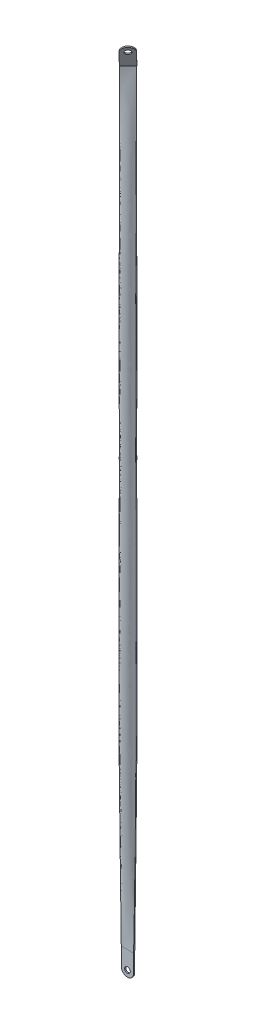
ISO-10303-21;
HEADER;
FILE_DESCRIPTION(('STEP AP214'),'2;1');
FILE_NAME('part.step','',(''),(''),'','','');
FILE_SCHEMA(('AUTOMOTIVE_DESIGN { 1 0 10303 214 1 1 1 1 }'));
ENDSEC;
DATA;
#1=APPLICATION_CONTEXT('core data for automotive mechanical design processes');
#2=APPLICATION_PROTOCOL_DEFINITION('international standard','automotive_design',2000,#1);
#3=PRODUCT_CONTEXT('',#1,'mechanical');
#4=PRODUCT('Part','Part','',(#3));
#5=PRODUCT_RELATED_PRODUCT_CATEGORY('part','',(#4));
#6=PRODUCT_DEFINITION_FORMATION('','',#4);
#7=PRODUCT_DEFINITION_CONTEXT('part definition',#1,'design');
#8=PRODUCT_DEFINITION('design','',#6,#7);
#9=PRODUCT_DEFINITION_SHAPE('','',#8);
#10=(LENGTH_UNIT() NAMED_UNIT(*) SI_UNIT(.MILLI.,.METRE.));
#11=(NAMED_UNIT(*) PLANE_ANGLE_UNIT() SI_UNIT($,.RADIAN.));
#12=(NAMED_UNIT(*) SI_UNIT($,.STERADIAN.) SOLID_ANGLE_UNIT());
#13=UNCERTAINTY_MEASURE_WITH_UNIT(LENGTH_MEASURE(1.E-05),#10,'distance_accuracy_value','');
#14=(GEOMETRIC_REPRESENTATION_CONTEXT(3) GLOBAL_UNCERTAINTY_ASSIGNED_CONTEXT((#13)) GLOBAL_UNIT_ASSIGNED_CONTEXT((#10,
#11,#12)) REPRESENTATION_CONTEXT('',''));
#15=CARTESIAN_POINT('',(0.,0.,0.));
#16=DIRECTION('',(0.,0.,1.));
#17=DIRECTION('',(1.,0.,0.));
#18=AXIS2_PLACEMENT_3D('',#15,#16,#17);
#19=CARTESIAN_POINT('',(9.0209387786131,863.732266545044,-10.8169900028267));
#20=DIRECTION('',(0.00334740769236719,-0.999988794798963,-0.00334740769236719));
#21=DIRECTION('',(0.,0.00334742644660771,-0.999994397352398));
#22=AXIS2_PLACEMENT_3D('',#19,#20,#21);
#23=PLANE('',#22);
#24=DIRECTION('',(0.707106781186548,0.,0.707106781186548));
#25=VECTOR('',#24,1.);
#26=CARTESIAN_POINT('',(-10.7354033114742,863.6,8.93935208726004));
#27=LINE('',#26,#25);
#28=CARTESIAN_POINT('',(-10.7354033114742,863.6,8.93935208726004));
#29=VERTEX_POINT('',#28);
#30=CARTESIAN_POINT('',(-8.93935208726027,863.6,10.7354033114738));
#31=VERTEX_POINT('',#30);
#32=EDGE_CURVE('E207',#29,#31,#27,.T.);
#33=ORIENTED_EDGE('',*,*,#32,.F.);
#34=DIRECTION('',(-0.707098857912909,-0.00473394935733769,0.707098857912909));
#35=VECTOR('',#34,1.);
#36=CARTESIAN_POINT('',(9.0209387786131,863.732266545044,-10.8169900028267));
#37=LINE('',#36,#35);
#38=CARTESIAN_POINT('',(9.0209387786131,863.732266545044,-10.8169900028267));
#39=VERTEX_POINT('',#38);
#40=EDGE_CURVE('E181',#39,#29,#37,.T.);
#41=ORIENTED_EDGE('',*,*,#40,.F.);
#42=DIRECTION('',(0.707106781186548,0.,0.707106781186548));
#43=VECTOR('',#42,1.);
#44=CARTESIAN_POINT('',(9.0209387786131,863.732266545044,-10.8169900028267));
#45=LINE('',#44,#43);
#46=CARTESIAN_POINT('',(10.8169900028268,863.732266545044,-9.02093877861287));
#47=VERTEX_POINT('',#46);
#48=EDGE_CURVE('E189',#39,#47,#45,.T.);
#49=ORIENTED_EDGE('',*,*,#48,.T.);
#50=DIRECTION('',(-0.707098857912909,-0.00473394935733769,0.707098857912909));
#51=VECTOR('',#50,1.);
#52=CARTESIAN_POINT('',(10.8169900028268,863.732266545044,-9.02093877861287));
#53=LINE('',#52,#51);
#54=EDGE_CURVE('E171',#47,#31,#53,.T.);
#55=ORIENTED_EDGE('',*,*,#54,.T.);
#56=EDGE_LOOP('',(#33,#41,#49,#55));
#57=FACE_BOUND('',#56,.T.);
#58=ADVANCED_FACE('F127',(#57),#23,.T.);
#59=CARTESIAN_POINT('',(9.0209387786131,863.732266545044,-10.8169900028267));
#60=DIRECTION('',(-0.66344697747786,0.350404768646569,-0.661101055955319));
#61=DIRECTION('',(-0.705853309553858,0.,0.708358034747871));
#62=AXIS2_PLACEMENT_3D('',#59,#60,#61);
#63=PLANE('',#62);
#64=CARTESIAN_POINT('',(8.92963865146323,901.134272272187,9.09889704429256));
#65=DIRECTION('',(-0.66344697747786,0.350404768646569,-0.661101055955319));
#66=DIRECTION('',(-0.705853309553858,0.,0.708358034747871));
#67=AXIS2_PLACEMENT_3D('',#64,#65,#66);
#68=CIRCLE('',#67,6.34999999999999);
#69=CARTESIAN_POINT('',(4.44747013579624,901.134272272187,13.5969705649415));
#70=VERTEX_POINT('',#69);
#71=EDGE_CURVE('E203',#70,#70,#68,.T.);
#72=ORIENTED_EDGE('',*,*,#71,.F.);
#73=EDGE_LOOP('',(#72));
#74=FACE_BOUND('',#73,.T.);
#75=CARTESIAN_POINT('',(8.92963865146346,901.134272272186,9.09889704429268));
#76=DIRECTION('',(-0.66344697747786,0.350404768646569,-0.661101055955319));
#77=DIRECTION('',(-0.705853309553858,0.,0.708358034747871));
#78=AXIS2_PLACEMENT_3D('',#75,#76,#77);
#79=CIRCLE('',#78,13.97);
#80=CARTESIAN_POINT('',(-0.948532393579837,901.068138999664,18.9770680893362));
#81=VERTEX_POINT('',#80);
#82=CARTESIAN_POINT('',(12.3472761148551,914.218384303815,12.6041312037478));
#83=VERTEX_POINT('',#82);
#84=EDGE_CURVE('E214',#81,#83,#79,.T.);
#85=ORIENTED_EDGE('',*,*,#84,.T.);
#86=CARTESIAN_POINT('',(8.92963865146368,901.134272272186,9.09889704429268));
#87=DIRECTION('',(-0.66344697747786,0.350404768646569,-0.661101055955319));
#88=DIRECTION('',(-0.705853309553858,0.,0.708358034747871));
#89=AXIS2_PLACEMENT_3D('',#86,#87,#88);
#90=CIRCLE('',#89,13.97);
#91=CARTESIAN_POINT('',(18.8078096965068,901.200405544708,-0.779274000750618));
#92=VERTEX_POINT('',#91);
#93=EDGE_CURVE('E218',#83,#92,#90,.T.);
#94=ORIENTED_EDGE('',*,*,#93,.T.);
#95=DIRECTION('',(-0.244641192798251,-0.936586401691391,-0.250911536109885));
#96=VECTOR('',#95,1.);
#97=CARTESIAN_POINT('',(9.0209387786131,863.732266545044,-10.8169900028267));
#98=LINE('',#97,#96);
#99=EDGE_CURVE('E182',#92,#39,#98,.T.);
#100=ORIENTED_EDGE('',*,*,#99,.T.);
#101=ORIENTED_EDGE('',*,*,#40,.T.);
#102=DIRECTION('',(-0.244641192798251,-0.936586401691391,-0.250911536109885));
#103=VECTOR('',#102,1.);
#104=CARTESIAN_POINT('',(-10.7354033114742,863.6,8.93935208726004));
#105=LINE('',#104,#103);
#106=EDGE_CURVE('E197',#81,#29,#105,.T.);
#107=ORIENTED_EDGE('',*,*,#106,.F.);
#108=EDGE_LOOP('',(#85,#94,#100,#101,#107));
#109=FACE_BOUND('',#108,.T.);
#110=ADVANCED_FACE('F244',(#74,#109),#63,.T.);
#111=CARTESIAN_POINT('',(24.0187519975847,913.337369442282,4.51292394343872));
#112=DIRECTION('',(0.661941239918019,-0.356115494727767,0.659557085710247));
#113=DIRECTION('',(0.705829920236347,0.,-0.708381340592163));
#114=AXIS2_PLACEMENT_3D('',#111,#112,#113);
#115=PLANE('',#114);
#116=CARTESIAN_POINT('',(10.6663651216343,900.217006450439,10.8294825203167));
#117=DIRECTION('',(0.661941239918019,-0.356115494727767,0.659557085710247));
#118=DIRECTION('',(-0.248686549765076,-0.934429956785569,-0.254942455914394));
#119=AXIS2_PLACEMENT_3D('',#116,#117,#118);
#120=ELLIPSE('',#119,6.35011831375996,6.34999999999993);
#121=CARTESIAN_POINT('',(9.08717610758534,894.283265668929,9.21056776205975));
#122=VERTEX_POINT('',#121);
#123=EDGE_CURVE('E131',#122,#122,#120,.T.);
#124=ORIENTED_EDGE('',*,*,#123,.F.);
#125=EDGE_LOOP('',(#124));
#126=FACE_BOUND('',#125,.T.);
#127=DIRECTION('',(0.24868654976507,0.934429956785569,0.2549424559144));
#128=VECTOR('',#127,1.);
#129=CARTESIAN_POINT('',(24.0187519975847,913.337369442282,4.51292394343872));
#130=LINE('',#129,#128);
#131=CARTESIAN_POINT('',(20.5445361666774,900.28313972296,0.951311475273386));
#132=VERTEX_POINT('',#131);
#133=EDGE_CURVE('E174',#47,#132,#130,.T.);
#134=ORIENTED_EDGE('',*,*,#133,.T.);
#135=CARTESIAN_POINT('',(10.6663651216339,900.217006450438,10.8294825203166));
#136=DIRECTION('',(0.661941239918019,-0.356115494727767,0.659557085710247));
#137=DIRECTION('',(0.248686549765124,0.934429956785569,0.254942455914346));
#138=AXIS2_PLACEMENT_3D('',#135,#136,#137);
#139=ELLIPSE('',#138,13.9702602902721,13.97);
#140=CARTESIAN_POINT('',(14.1405809525414,913.271236169761,14.3910949884821));
#141=VERTEX_POINT('',#140);
#142=EDGE_CURVE('E137',#132,#141,#139,.T.);
#143=ORIENTED_EDGE('',*,*,#142,.T.);
#144=CARTESIAN_POINT('',(10.6663651216339,900.217006450438,10.8294825203168));
#145=DIRECTION('',(0.661941239918019,-0.356115494727767,0.659557085710247));
#146=DIRECTION('',(-0.248686549765124,-0.934429956785569,-0.254942455914346));
#147=AXIS2_PLACEMENT_3D('',#144,#145,#146);
#148=ELLIPSE('',#147,13.9702602902721,13.97);
#149=CARTESIAN_POINT('',(0.788194076591031,900.150873177916,20.7076535653601));
#150=VERTEX_POINT('',#149);
#151=EDGE_CURVE('E148',#141,#150,#148,.T.);
#152=ORIENTED_EDGE('',*,*,#151,.T.);
#153=DIRECTION('',(0.24868654976507,0.934429956785569,0.2549424559144));
#154=VECTOR('',#153,1.);
#155=CARTESIAN_POINT('',(4.26240990749838,913.205102897238,24.2692660335256));
#156=LINE('',#155,#154);
#157=EDGE_CURVE('E175',#31,#150,#156,.T.);
#158=ORIENTED_EDGE('',*,*,#157,.F.);
#159=ORIENTED_EDGE('',*,*,#54,.F.);
#160=EDGE_LOOP('',(#134,#143,#152,#158,#159));
#161=FACE_BOUND('',#160,.T.);
#162=ADVANCED_FACE('F173',(#126,#161),#115,.T.);
#163=CARTESIAN_POINT('',(12.8099737399687,0.0857613702458793,-12.8099737399692));
#164=DIRECTION('',(-0.707098857912909,-0.00473394935733767,0.70709885791291));
#165=DIRECTION('',(0.707106781186548,0.,0.707106781186548));
#166=AXIS2_PLACEMENT_3D('',#163,#164,#165);
#167=PLANE('',#166);
#168=ORIENTED_EDGE('',*,*,#99,.F.);
#169=DIRECTION('',(-0.663446977477863,0.350404768646559,-0.661101055955321));
#170=VECTOR('',#169,1.);
#171=CARTESIAN_POINT('',(20.6011145341933,900.253257410653,1.00768978398369));
#172=LINE('',#171,#170);
#173=EDGE_CURVE('E191',#92,#132,#172,.F.);
#174=ORIENTED_EDGE('',*,*,#173,.T.);
#175=ORIENTED_EDGE('',*,*,#133,.F.);
#176=ORIENTED_EDGE('',*,*,#48,.F.);
#177=EDGE_LOOP('',(#168,#174,#175,#176));
#178=FACE_BOUND('',#177,.T.);
#179=ADVANCED_FACE('F188',(#178),#167,.F.);
#180=CARTESIAN_POINT('',(-6.94636835011786,-0.0465051747982337,6.94636835011764));
#181=DIRECTION('',(-0.707098857912909,-0.00473394935733767,0.70709885791291));
#182=DIRECTION('',(0.707106781186548,0.,0.707106781186548));
#183=AXIS2_PLACEMENT_3D('',#180,#181,#182);
#184=PLANE('',#183);
#185=ORIENTED_EDGE('',*,*,#157,.T.);
#186=DIRECTION('',(-0.663446977477863,0.350404768646559,-0.661101055955321));
#187=VECTOR('',#186,1.);
#188=CARTESIAN_POINT('',(200.621330815878,794.60742144159,219.834188462589));
#189=LINE('',#188,#187);
#190=EDGE_CURVE('E13',#150,#81,#189,.T.);
#191=ORIENTED_EDGE('',*,*,#190,.T.);
#192=ORIENTED_EDGE('',*,*,#106,.T.);
#193=ORIENTED_EDGE('',*,*,#32,.T.);
#194=EDGE_LOOP('',(#185,#191,#192,#193));
#195=FACE_BOUND('',#194,.T.);
#196=ADVANCED_FACE('F259',(#195),#184,.T.);
#197=CARTESIAN_POINT('',(210.499501860921,794.673554714112,209.956017417546));
#198=DIRECTION('',(-0.663446977477863,0.350404768646559,-0.661101055955321));
#199=DIRECTION('',(-0.705853309553857,0.,0.708358034747871));
#200=AXIS2_PLACEMENT_3D('',#197,#198,#199);
#201=CYLINDRICAL_SURFACE('',#200,13.97);
#202=ORIENTED_EDGE('',*,*,#190,.F.);
#203=ORIENTED_EDGE('',*,*,#151,.F.);
#204=DIRECTION('',(-0.663446977477863,0.350404768646559,-0.661101055955321));
#205=VECTOR('',#204,1.);
#206=CARTESIAN_POINT('',(12.3472761148551,914.218384303815,12.6041312037478));
#207=LINE('',#206,#205);
#208=EDGE_CURVE('E210',#83,#141,#207,.F.);
#209=ORIENTED_EDGE('',*,*,#208,.F.);
#210=ORIENTED_EDGE('',*,*,#84,.F.);
#211=EDGE_LOOP('',(#202,#203,#209,#210));
#212=FACE_BOUND('',#211,.T.);
#213=ADVANCED_FACE('F129',(#212),#201,.T.);
#214=CARTESIAN_POINT('',(8.92963865146346,901.134272272186,9.09889704429268));
#215=DIRECTION('',(0.663446977477863,-0.350404768646559,0.661101055955321));
#216=DIRECTION('',(0.705853309553857,0.,-0.708358034747871));
#217=AXIS2_PLACEMENT_3D('',#214,#215,#216);
#218=CYLINDRICAL_SURFACE('',#217,13.97);
#219=ORIENTED_EDGE('',*,*,#142,.F.);
#220=ORIENTED_EDGE('',*,*,#173,.F.);
#221=ORIENTED_EDGE('',*,*,#93,.F.);
#222=ORIENTED_EDGE('',*,*,#208,.T.);
#223=EDGE_LOOP('',(#219,#220,#221,#222));
#224=FACE_BOUND('',#223,.T.);
#225=ADVANCED_FACE('F252',(#224),#218,.T.);
#226=CARTESIAN_POINT('',(8.92963865146323,901.134272272187,9.09889704429256));
#227=DIRECTION('',(-0.66344697747786,0.350404768646569,-0.661101055955319));
#228=DIRECTION('',(-0.705853309553858,0.,0.708358034747871));
#229=AXIS2_PLACEMENT_3D('',#226,#227,#228);
#230=CYLINDRICAL_SURFACE('',#229,6.34999999999993);
#231=ORIENTED_EDGE('',*,*,#123,.T.);
#232=EDGE_LOOP('',(#231));
#233=FACE_BOUND('',#232,.T.);
#234=ORIENTED_EDGE('',*,*,#71,.T.);
#235=EDGE_LOOP('',(#234));
#236=FACE_BOUND('',#235,.T.);
#237=ADVANCED_FACE('F242',(#233,#236),#230,.F.);
#238=CLOSED_SHELL('',(#58,#110,#162,#179,#196,#213,#225,#237));
#239=MANIFOLD_SOLID_BREP('B2',#238);
#240=CARTESIAN_POINT('',(-2.22044604925031E-13,863.6,1.11022302462516E-13));
#241=DIRECTION('',(0.,1.,0.));
#242=DIRECTION('',(0.,0.,1.));
#243=AXIS2_PLACEMENT_3D('',#240,#241,#242);
#244=PLANE('',#243);
#245=DIRECTION('',(-0.707106781186549,0.,-0.707106781186547));
#246=VECTOR('',#245,1.);
#247=CARTESIAN_POINT('',(8.93935208726004,863.6,-10.7354033114737));
#248=LINE('',#247,#246);
#249=CARTESIAN_POINT('',(10.7354033114735,863.6,-8.93935208725982));
#250=VERTEX_POINT('',#249);
#251=CARTESIAN_POINT('',(8.93935208726004,863.6,-10.7354033114737));
#252=VERTEX_POINT('',#251);
#253=EDGE_CURVE('E401',#250,#252,#248,.T.);
#254=ORIENTED_EDGE('',*,*,#253,.T.);
#255=DIRECTION('',(-0.707106781186546,0.,0.707106781186549));
#256=VECTOR('',#255,1.);
#257=CARTESIAN_POINT('',(-10.7354033114742,863.6,8.93935208726004));
#258=LINE('',#257,#256);
#259=CARTESIAN_POINT('',(-10.7354033114742,863.6,8.93935208726004));
#260=VERTEX_POINT('',#259);
#261=EDGE_CURVE('E436',#252,#260,#258,.T.);
#262=ORIENTED_EDGE('',*,*,#261,.T.);
#263=DIRECTION('',(0.707106781186549,0.,0.707106781186547));
#264=VECTOR('',#263,1.);
#265=CARTESIAN_POINT('',(-10.7354033114742,863.6,8.93935208726004));
#266=LINE('',#265,#264);
#267=CARTESIAN_POINT('',(-8.93935208726027,863.6,10.7354033114739));
#268=VERTEX_POINT('',#267);
#269=EDGE_CURVE('E557',#260,#268,#266,.T.);
#270=ORIENTED_EDGE('',*,*,#269,.T.);
#271=DIRECTION('',(0.707106781186546,0.,-0.707106781186549));
#272=VECTOR('',#271,1.);
#273=CARTESIAN_POINT('',(-8.93935208726027,863.6,10.7354033114739));
#274=LINE('',#273,#272);
#275=EDGE_CURVE('E576',#268,#250,#274,.T.);
#276=ORIENTED_EDGE('',*,*,#275,.T.);
#277=EDGE_LOOP('',(#254,#262,#270,#276));
#278=FACE_BOUND('',#277,.T.);
#279=ADVANCED_FACE('F332',(#278),#244,.T.);
#280=CARTESIAN_POINT('',(-8.93935208726027,863.6,10.7354033114739));
#281=CARTESIAN_POINT('',(-10.7535904870468,745.07341200973,8.49148686611645));
#282=CARTESIAN_POINT('',(-13.42216710368,457.262839703525,5.25504106151542));
#283=CARTESIAN_POINT('',(-12.1813845276058,1.13473938578856E-06,6.39968502166344));
#284=CARTESIAN_POINT('',(-11.9437757602201,-457.26284641882,8.07136228076999));
#285=CARTESIAN_POINT('',(-13.0942198572812,-745.073412321946,4.03734135019929));
#286=CARTESIAN_POINT('',(-13.9121529606314,-863.6,1.26999999999988));
#287=CARTESIAN_POINT('',(-9.53803582866475,863.6,10.1367195700692));
#288=CARTESIAN_POINT('',(-11.2068466169617,745.07341200973,7.79566775567742));
#289=CARTESIAN_POINT('',(-13.7863837243992,457.262839703525,4.46933543834138));
#290=CARTESIAN_POINT('',(-12.5414689736312,1.13473946905529E-06,5.64726781138714));
#291=CARTESIAN_POINT('',(-12.4861241674183,-457.26284641882,7.35937129392006));
#292=CARTESIAN_POINT('',(-13.2657495473076,-745.073412321946,3.22479406025178));
#293=CARTESIAN_POINT('',(-13.9121529606314,-863.6,0.423333333333553));
#294=CARTESIAN_POINT('',(-10.1367195700692,863.6,9.53803582866464));
#295=CARTESIAN_POINT('',(-11.660102746877,745.073412009731,7.09984864523849));
#296=CARTESIAN_POINT('',(-14.0318809632292,457.262839703525,3.62478129122012));
#297=CARTESIAN_POINT('',(-12.8613791101011,1.13473927476626E-06,4.87493642382753));
#298=CARTESIAN_POINT('',(-12.9097463020171,-457.26284641882,6.58852836743684));
#299=CARTESIAN_POINT('',(-13.4372792373338,-745.073412321946,2.41224677030405));
#300=CARTESIAN_POINT('',(-13.9121529606316,-863.6,-0.423333333333331));
#301=CARTESIAN_POINT('',(-10.7354033114742,863.6,8.93935208726004));
#302=CARTESIAN_POINT('',(-12.1133588767919,745.073412009731,6.40402953479935));
#303=CARTESIAN_POINT('',(-14.1518187317207,457.262839703525,2.73789205445252));
#304=CARTESIAN_POINT('',(-13.1388002700561,1.13473933027741E-06,4.08827895935038));
#305=CARTESIAN_POINT('',(-13.2078016785548,-457.26284641882,5.77534789409395));
#306=CARTESIAN_POINT('',(-13.6088089273598,-745.073412321946,1.59969948035643));
#307=CARTESIAN_POINT('',(-13.9121529606314,-863.6,-1.26999999999988));
#308=B_SPLINE_SURFACE_WITH_KNOTS('',3,3,((#280,#281,#282,#283,#284,#285,#286),(#287,#288,#289,
#290,#291,#292,#293),(#294,#295,#296,#297,#298,#299,#300),(#301,#302,#303,#304,#305,#306,#307)),
.UNSPECIFIED.,.F.,.F.,.F.,(4,4),(4,1,1,1,4),(0.,1.),(0.,0.205912628052796,0.499999997518714,
0.794087366984304,1.),.UNSPECIFIED.);
#309=CARTESIAN_POINT('',(-10.7354033114742,863.6,8.93935208726004));
#310=CARTESIAN_POINT('',(-12.1133588767919,745.073412009731,6.40402953479935));
#311=CARTESIAN_POINT('',(-14.1518187317207,457.262839703525,2.73789205445252));
#312=CARTESIAN_POINT('',(-13.1388002700561,1.13473933027741E-06,4.08827895935038));
#313=CARTESIAN_POINT('',(-13.2078016785548,-457.26284641882,5.77534789409395));
#314=CARTESIAN_POINT('',(-13.6088089273598,-745.073412321946,1.59969948035643));
#315=CARTESIAN_POINT('',(-13.9121529606314,-863.6,-1.26999999999988));
#316=B_SPLINE_CURVE_WITH_KNOTS('',3,(#309,#310,#311,#312,#313,#314,#315),.UNSPECIFIED.,.F.,.F.,
(4,1,1,1,4),(0.,0.205912628052796,0.499999997518714,0.794087366984304,1.),.UNSPECIFIED.);
#317=CARTESIAN_POINT('',(-13.9121529606314,-863.6,-1.26999999999988));
#318=VERTEX_POINT('',#317);
#319=EDGE_CURVE('E440',#260,#318,#316,.T.);
#320=DIRECTION('',(0.,0.,1.));
#321=VECTOR('',#320,1.);
#322=CARTESIAN_POINT('',(-13.9121529606314,-863.6,-1.26999999999988));
#323=LINE('',#322,#321);
#324=CARTESIAN_POINT('',(-13.9121529606312,-863.6,1.2700000000001));
#325=VERTEX_POINT('',#324);
#326=EDGE_CURVE('E417',#318,#325,#323,.T.);
#327=CARTESIAN_POINT('',(-8.93935208726027,863.6,10.7354033114739));
#328=CARTESIAN_POINT('',(-10.7535904870468,745.07341200973,8.49148686611645));
#329=CARTESIAN_POINT('',(-13.42216710368,457.262839703525,5.25504106151542));
#330=CARTESIAN_POINT('',(-12.1813845276058,1.13473938578856E-06,6.39968502166344));
#331=CARTESIAN_POINT('',(-11.9437757602201,-457.26284641882,8.07136228076999));
#332=CARTESIAN_POINT('',(-13.0942198572812,-745.073412321946,4.03734135019929));
#333=CARTESIAN_POINT('',(-13.9121529606314,-863.6,1.26999999999988));
#334=B_SPLINE_CURVE_WITH_KNOTS('',3,(#327,#328,#329,#330,#331,#332,#333),.UNSPECIFIED.,.F.,.F.,
(4,1,1,1,4),(0.,0.205912628052796,0.499999997518714,0.794087366984304,1.),.UNSPECIFIED.);
#335=EDGE_CURVE('E447',#325,#268,#334,.F.);
#336=ORIENTED_EDGE('',*,*,#269,.F.);
#337=ORIENTED_EDGE('',*,*,#319,.T.);
#338=ORIENTED_EDGE('',*,*,#326,.T.);
#339=ORIENTED_EDGE('',*,*,#335,.T.);
#340=EDGE_LOOP('',(#336,#337,#338,#339));
#341=FACE_BOUND('',#340,.T.);
#342=ADVANCED_FACE('F517',(#341),#308,.T.);
#343=CARTESIAN_POINT('',(-10.7354033114742,863.6,8.93935208726004));
#344=CARTESIAN_POINT('',(-12.1133588767919,745.073412009731,6.40402953479935));
#345=CARTESIAN_POINT('',(-14.1518187317207,457.262839703525,2.73789205445252));
#346=CARTESIAN_POINT('',(-13.1388002700561,1.13473933027741E-06,4.08827895935038));
#347=CARTESIAN_POINT('',(-13.2078016785548,-457.26284641882,5.77534789409395));
#348=CARTESIAN_POINT('',(-13.6088089273598,-745.073412321946,1.59969948035643));
#349=CARTESIAN_POINT('',(-13.9121529606314,-863.6,-1.26999999999988));
#350=CARTESIAN_POINT('',(-10.3255125740003,863.6,8.52946134978627));
#351=CARTESIAN_POINT('',(-12.035615732696,745.075404312004,5.75258793247646));
#352=CARTESIAN_POINT('',(-14.6701730283967,457.26142623731,1.71825397213454));
#353=CARTESIAN_POINT('',(-13.2448861828993,0.000790532041022862,3.35537189186264));
#354=CARTESIAN_POINT('',(-13.7766784848319,-457.264117179755,4.63371078027142));
#355=CARTESIAN_POINT('',(-13.4511858869866,-745.071645766612,1.14111380884363));
#356=CARTESIAN_POINT('',(-13.3324799206052,-863.6,-1.26999999999988));
#357=CARTESIAN_POINT('',(-9.50573109905295,863.6,7.70967987483928));
#358=CARTESIAN_POINT('',(-11.8801294445043,745.079388916551,4.44970472783102));
#359=CARTESIAN_POINT('',(-15.4065410779183,457.258599304883,-0.348072603064686));
#360=CARTESIAN_POINT('',(-13.3554236015674,0.00236932664465783,1.88040397297828));
#361=CARTESIAN_POINT('',(-14.6140741211904,-457.266658701627,2.32338457200287));
#362=CARTESIAN_POINT('',(-13.1359398062401,-745.068112655945,0.223942465817695));
#363=CARTESIAN_POINT('',(-12.1731338405526,-863.6,-1.26999999999999));
#364=CARTESIAN_POINT('',(-8.27605888663241,863.600000000001,6.4800076624183));
#365=CARTESIAN_POINT('',(-11.3082783152703,745.086804401309,2.4952677864325));
#366=CARTESIAN_POINT('',(-15.8980465489702,457.253643181095,-3.42621615997285));
#367=CARTESIAN_POINT('',(-13.0897239181913,0.003745033522351,-0.324916861608848));
#368=CARTESIAN_POINT('',(-15.2570604891473,-457.266380462767,-1.12070555394583));
#369=CARTESIAN_POINT('',(-12.3244661689832,-745.068977464446,-1.15200838317431));
#370=CARTESIAN_POINT('',(-10.4341147204734,-863.6,-1.2700000000001));
#371=CARTESIAN_POINT('',(-7.04638667421098,863.6,5.25033544999742));
#372=CARTESIAN_POINT('',(-10.5085076174811,745.09388423087,0.581621297763846));
#373=CARTESIAN_POINT('',(-15.7496796756482,457.24903136081,-6.40730081956287));
#374=CARTESIAN_POINT('',(-12.4566770224999,0.00444366698251764,-2.47040240903118));
#375=CARTESIAN_POINT('',(-15.2601512506287,-457.264144240779,-4.46773210655882));
#376=CARTESIAN_POINT('',(-11.2850360609955,-745.07273062497,-2.48716458932929));
#377=CARTESIAN_POINT('',(-8.69509560039461,-863.600000000001,-1.26999999999999));
#378=CARTESIAN_POINT('',(-5.81671446179066,863.600000000001,4.02066323757655));
#379=CARTESIAN_POINT('',(-9.46830006356558,745.099996285426,-1.26250105227443));
#380=CARTESIAN_POINT('',(-15.0118252368736,457.245164495891,-9.21138679512978));
#381=CARTESIAN_POINT('',(-11.4650477290816,0.00445979886631864,-4.50998277304526));
#382=CARTESIAN_POINT('',(-14.6737418353553,-457.260332229887,-7.63776705304831));
#383=CARTESIAN_POINT('',(-10.0051191512245,-745.078765864849,-3.75276464849761));
#384=CARTESIAN_POINT('',(-6.9560764803156,-863.600000000001,-1.26999999999988));
#385=CARTESIAN_POINT('',(-4.58704224936968,863.600000000001,2.79099102515579));
#386=CARTESIAN_POINT('',(-8.21342029429428,745.104455299951,-3.00292734977892));
#387=CARTESIAN_POINT('',(-13.7274778410097,457.242454603186,-11.7541552319478));
#388=CARTESIAN_POINT('',(-10.1464320402298,0.00390192583241133,-6.39250779653855));
#389=CARTESIAN_POINT('',(-13.5408332026627,-457.255725373564,-10.5465030245309));
#390=CARTESIAN_POINT('',(-8.51047567131102,-745.085881292619,-4.91460849382797));
#391=CARTESIAN_POINT('',(-5.21705736023681,-863.600000000001,-1.26999999999988));
#392=CARTESIAN_POINT('',(-3.35737003694891,863.6,1.56131881273491));
#393=CARTESIAN_POINT('',(-6.74952723408939,745.106800944196,-4.61102005104264));
#394=CARTESIAN_POINT('',(-11.9167783379504,457.241171482692,-13.9627476711437));
#395=CARTESIAN_POINT('',(-8.51139162955428,0.00287867269854747,-8.07437141332168));
#396=CARTESIAN_POINT('',(-11.8815627612467,-457.250962834211,-13.1210826800019));
#397=CARTESIAN_POINT('',(-6.80677220981973,-745.093099341348,-5.94404824520156));
#398=CARTESIAN_POINT('',(-3.47803824015824,-863.6,-1.26999999999999));
#399=CARTESIAN_POINT('',(-2.12769782452793,863.6,0.331646600313817));
#400=CARTESIAN_POINT('',(-5.10629164554466,745.106760877427,-6.04893650946625));
#401=CARTESIAN_POINT('',(-9.65303159724185,457.241461137853,-15.7417546187437));
#402=CARTESIAN_POINT('',(-6.60436876849979,0.0015240803396821,-9.49824842438729));
#403=CARTESIAN_POINT('',(-9.7692301259078,-457.246646401171,-15.2660879596225));
#404=CARTESIAN_POINT('',(-4.92369651870606,-745.099509410484,-6.80324356411954));
#405=CARTESIAN_POINT('',(-1.73901912007923,-863.6,-1.2700000000001));
#406=CARTESIAN_POINT('',(-0.898025612106945,863.6,-0.898025612106723));
#407=CARTESIAN_POINT('',(-3.269936652603,745.10426609328,-7.29661891099442));
#408=CARTESIAN_POINT('',(-6.90190182648309,457.243335528958,-17.0405033781826));
#409=CARTESIAN_POINT('',(-4.40463254761836,4.05830230532089E-07,-10.6337236308718));
#410=CARTESIAN_POINT('',(-7.16948565632358,-457.243339765585,-16.930831131573));
#411=CARTESIAN_POINT('',(-2.84748957190928,-745.104269877327,-7.47215445279581));
#412=CARTESIAN_POINT('',(0.,-863.6,-1.26999999999999));
#413=CARTESIAN_POINT('',(0.331646600313595,863.6,-2.12769782452771));
#414=CARTESIAN_POINT('',(-1.32893863396055,745.099505877149,-8.29169894251924));
#415=CARTESIAN_POINT('',(-3.88665070310168,457.24664199934,-17.7015889330624));
#416=CARTESIAN_POINT('',(-2.04628193150702,-0.00152323389412956,-11.3862698129119));
#417=CARTESIAN_POINT('',(-4.30559207639281,-457.241465327565,-17.9578797927784));
#418=CARTESIAN_POINT('',(-0.666652395245437,-745.106764746479,-7.88843737824574));
#419=CARTESIAN_POINT('',(1.73901912007857,-863.6,-1.2700000000001));
#420=CARTESIAN_POINT('',(1.56131881273458,863.6,-3.35737003694847));
#421=CARTESIAN_POINT('',(0.610046513438878,745.093096200594,-9.01568173133382));
#422=CARTESIAN_POINT('',(-0.876454910306634,457.250958164374,-17.6784648839912));
#423=CARTESIAN_POINT('',(0.309019954348067,-0.0028777240850264,-11.7279055218467));
#424=CARTESIAN_POINT('',(-1.44673680900254,-457.241175751831,-18.3006635834626));
#425=CARTESIAN_POINT('',(1.51214439285385,-745.106804719131,-8.03362988422429));
#426=CARTESIAN_POINT('',(3.47803824015758,-863.6,-1.26999999999999));
#427=CARTESIAN_POINT('',(2.79099102515556,863.6,-4.58704224936946));
#428=CARTESIAN_POINT('',(2.54257777628908,745.085878644976,-9.49246515752922));
#429=CARTESIAN_POINT('',(2.11713343884345,457.25572036096,-17.0312582885763));
#430=CARTESIAN_POINT('',(2.6544252832057,-0.00390081751744376,-11.694796518013));
#431=CARTESIAN_POINT('',(1.39552754798711,-457.242459072636,-18.0192960264393));
#432=CARTESIAN_POINT('',(3.68445919402371,-745.10445880724,-7.93165834993148));
#433=CARTESIAN_POINT('',(5.21705736023659,-863.6,-1.26999999999988));
#434=CARTESIAN_POINT('',(4.02066323757655,863.6,-5.81671446179022));
#435=CARTESIAN_POINT('',(4.42090885767232,745.078763769878,-9.72781357511221));
#436=CARTESIAN_POINT('',(4.9748197667685,457.260326827785,-15.7756083523259));
#437=CARTESIAN_POINT('',(4.91797358664825,-0.00445848431365747,-11.2960524070458));
#438=CARTESIAN_POINT('',(4.10189508963166,-457.245169277169,-17.1294083478429));
#439=CARTESIAN_POINT('',(5.8025495452505,-745.099999362972,-7.58830156611445));
#440=CARTESIAN_POINT('',(6.95607648031538,-863.6,-1.26999999999977));
#441=CARTESIAN_POINT('',(5.25033544999731,863.6,-7.0463866742112));
#442=CARTESIAN_POINT('',(6.22077742747207,745.072729094269,-9.73797609732241));
#443=CARTESIAN_POINT('',(7.63085062624103,457.264138435696,-13.9487915636574));
#444=CARTESIAN_POINT('',(7.06136248862999,-0.00444211476360867,-10.5550391030633));
#445=CARTESIAN_POINT('',(6.60660160286142,-457.249036547304,-15.6682796595418));
#446=CARTESIAN_POINT('',(7.84216251838066,-745.093886740604,-7.01980898435928));
#447=CARTESIAN_POINT('',(8.69509560039439,-863.6,-1.26999999999999));
#448=CARTESIAN_POINT('',(6.4800076624183,863.6,-8.27605888663197));
#449=CARTESIAN_POINT('',(7.89978805879832,745.068976457334,-9.52892018067575));
#450=CARTESIAN_POINT('',(9.99521058002206,457.266374277559,-11.5800142803693));
#451=CARTESIAN_POINT('',(9.02608161882212,-0.00374322913024305,-9.48558348138717));
#452=CARTESIAN_POINT('',(8.81961772928563,-457.253648844983,-13.6651323013777));
#453=CARTESIAN_POINT('',(9.76091366289111,-745.086806233514,-6.23212585198629));
#454=CARTESIAN_POINT('',(10.4341147204732,-863.6,-1.26999999999999));
#455=CARTESIAN_POINT('',(7.70967987483906,863.6,-9.50573109905284));
#456=CARTESIAN_POINT('',(9.44646436585761,745.068112098298,-9.12984156065844));
#457=CARTESIAN_POINT('',(11.9757523508832,457.26665218306,-8.69015804897089));
#458=CARTESIAN_POINT('',(10.7733569814401,-0.00236726985949898,-8.11406421798488));
#459=CARTESIAN_POINT('',(10.6487847576351,-457.258605493669,-11.1408659779862));
#460=CARTESIAN_POINT('',(11.5473354672035,-745.079389996136,-5.25442301209811));
#461=CARTESIAN_POINT('',(12.1731338405522,-863.6,-1.26999999999988));
#462=CARTESIAN_POINT('',(8.52946134978638,863.6,-10.3255125740002));
#463=CARTESIAN_POINT('',(10.3178817799838,745.071645372586,-8.704271764297));
#464=CARTESIAN_POINT('',(13.0171956407312,457.264110530036,-6.46449515948855));
#465=CARTESIAN_POINT('',(11.7381550392432,-0.000788333460205459,-6.99294264568029));
#466=CARTESIAN_POINT('',(11.5892833595894,-457.261432777103,-9.15894902077807));
#467=CARTESIAN_POINT('',(12.578591727255,-745.075404880009,-4.44303523749889));
#468=CARTESIAN_POINT('',(13.3324799206047,-863.6,-1.26999999999988));
#469=CARTESIAN_POINT('',(8.93935208726004,863.6,-10.7354033114737));
#470=CARTESIAN_POINT('',(10.7535904870464,745.07341200973,-8.49148686611634));
#471=CARTESIAN_POINT('',(13.4221671036794,457.262839703525,-5.25504106151498));
#472=CARTESIAN_POINT('',(12.1813845276053,1.13473944129971E-06,-6.39968502166366));
#473=CARTESIAN_POINT('',(11.9437757602194,-457.26284641882,-8.07136228076988));
#474=CARTESIAN_POINT('',(13.094219857281,-745.073412321946,-4.03734135019929));
#475=CARTESIAN_POINT('',(13.9121529606312,-863.6,-1.26999999999977));
#476=B_SPLINE_SURFACE_WITH_KNOTS('',3,3,((#343,#344,#345,#346,#347,#348,#349),(#350,#351,#352,
#353,#354,#355,#356),(#357,#358,#359,#360,#361,#362,#363),(#364,#365,#366,#367,#368,#369,#370),
(#371,#372,#373,#374,#375,#376,#377),(#378,#379,#380,#381,#382,#383,#384),(#385,#386,#387,#388,
#389,#390,#391),(#392,#393,#394,#395,#396,#397,#398),(#399,#400,#401,#402,#403,#404,#405),(#406,
#407,#408,#409,#410,#411,#412),(#413,#414,#415,#416,#417,#418,#419),(#420,#421,#422,#423,#424,
#425,#426),(#427,#428,#429,#430,#431,#432,#433),(#434,#435,#436,#437,#438,#439,#440),(#441,#442,
#443,#444,#445,#446,#447),(#448,#449,#450,#451,#452,#453,#454),(#455,#456,#457,#458,#459,#460,
#461),(#462,#463,#464,#465,#466,#467,#468),(#469,#470,#471,#472,#473,#474,#475)),.UNSPECIFIED.,
.F.,.F.,.F.,(4,1,1,1,1,1,1,1,1,1,1,1,1,1,1,1,4),(4,1,1,1,4),(0.,0.0625,0.125,0.1875,0.25,0.3125,
0.375,0.4375,0.5,0.5625,0.625,0.6875,0.75,0.8125,0.875,0.9375,1.),(0.,0.205912628052796,
0.499999997518714,0.794087366984304,1.),.UNSPECIFIED.);
#477=CARTESIAN_POINT('',(8.93935208726004,863.6,-10.7354033114737));
#478=CARTESIAN_POINT('',(10.7535904870464,745.07341200973,-8.49148686611634));
#479=CARTESIAN_POINT('',(13.4221671036794,457.262839703525,-5.25504106151498));
#480=CARTESIAN_POINT('',(12.1813845276053,1.13473944129971E-06,-6.39968502166366));
#481=CARTESIAN_POINT('',(11.9437757602194,-457.26284641882,-8.07136228076988));
#482=CARTESIAN_POINT('',(13.094219857281,-745.073412321946,-4.03734135019929));
#483=CARTESIAN_POINT('',(13.9121529606312,-863.6,-1.26999999999977));
#484=B_SPLINE_CURVE_WITH_KNOTS('',3,(#477,#478,#479,#480,#481,#482,#483),.UNSPECIFIED.,.F.,.F.,
(4,1,1,1,4),(0.,0.205912628052796,0.499999997518714,0.794087366984304,1.),.UNSPECIFIED.);
#485=CARTESIAN_POINT('',(13.9121529606312,-863.6,-1.26999999999977));
#486=VERTEX_POINT('',#485);
#487=EDGE_CURVE('E426',#252,#486,#484,.T.);
#488=DIRECTION('',(-1.,0.,0.));
#489=VECTOR('',#488,1.);
#490=CARTESIAN_POINT('',(-13.9121529606314,-863.6,-1.26999999999988));
#491=LINE('',#490,#489);
#492=EDGE_CURVE('E405',#486,#318,#491,.T.);
#493=ORIENTED_EDGE('',*,*,#261,.F.);
#494=ORIENTED_EDGE('',*,*,#487,.T.);
#495=ORIENTED_EDGE('',*,*,#492,.T.);
#496=ORIENTED_EDGE('',*,*,#319,.F.);
#497=EDGE_LOOP('',(#493,#494,#495,#496));
#498=FACE_BOUND('',#497,.T.);
#499=ADVANCED_FACE('F435',(#498),#476,.T.);
#500=CARTESIAN_POINT('',(10.7354033114735,863.6,-8.93935208725982));
#501=CARTESIAN_POINT('',(12.1133588767914,745.07341200973,-6.40402953479935));
#502=CARTESIAN_POINT('',(14.1518187317204,457.262839703525,-2.7378920544523));
#503=CARTESIAN_POINT('',(13.1388002700557,1.13473935803299E-06,-4.08827895935049));
#504=CARTESIAN_POINT('',(13.2078016785544,-457.26284641882,-5.77534789409406));
#505=CARTESIAN_POINT('',(13.6088089273594,-745.073412321946,-1.59969948035643));
#506=CARTESIAN_POINT('',(13.9121529606314,-863.6,1.2700000000001));
#507=CARTESIAN_POINT('',(10.3255125739998,863.6,-8.52946134978616));
#508=CARTESIAN_POINT('',(12.0356157326957,745.075404312004,-5.75258793247635));
#509=CARTESIAN_POINT('',(14.670173028396,457.261426237311,-1.71825397213432));
#510=CARTESIAN_POINT('',(13.2448861828989,0.000790532041217151,-3.35537189186264));
#511=CARTESIAN_POINT('',(13.7766784848314,-457.264117179755,-4.63371078027164));
#512=CARTESIAN_POINT('',(13.4511858869861,-745.071645766612,-1.14111380884341));
#513=CARTESIAN_POINT('',(13.3324799206049,-863.6,1.26999999999999));
#514=CARTESIAN_POINT('',(9.50573109905251,863.6,-7.70967987483895));
#515=CARTESIAN_POINT('',(11.8801294445041,745.079388916551,-4.44970472783068));
#516=CARTESIAN_POINT('',(15.4065410779176,457.258599304882,0.34807260306513));
#517=CARTESIAN_POINT('',(13.3554236015665,0.00236932664446354,-1.8804039729784));
#518=CARTESIAN_POINT('',(14.61407412119,-457.266658701627,-2.32338457200287));
#519=CARTESIAN_POINT('',(13.1359398062398,-745.068112655945,-0.223942465817806));
#520=CARTESIAN_POINT('',(12.1731338405522,-863.6,1.26999999999999));
#521=CARTESIAN_POINT('',(8.27605888663174,863.6,-6.48000766241819));
#522=CARTESIAN_POINT('',(11.3082783152703,745.086804401309,-2.49526778643228));
#523=CARTESIAN_POINT('',(15.89804654897,457.253643181095,3.42621615997296));
#524=CARTESIAN_POINT('',(13.0897239181909,0.00374503352237876,0.324916861608848));
#525=CARTESIAN_POINT('',(15.2570604891469,-457.266380462767,1.12070555394572));
#526=CARTESIAN_POINT('',(12.324466168983,-745.068977464446,1.1520083831742));
#527=CARTESIAN_POINT('',(10.4341147204732,-863.6,1.2700000000001));
#528=CARTESIAN_POINT('',(7.04638667421076,863.600000000001,-5.25033544999731));
#529=CARTESIAN_POINT('',(10.5085076174811,745.09388423087,-0.581621297763735));
#530=CARTESIAN_POINT('',(15.7496796756478,457.24903136081,6.40730081956309));
#531=CARTESIAN_POINT('',(12.4566770224996,0.00444366698240661,2.47040240903118));
#532=CARTESIAN_POINT('',(15.2601512506276,-457.264144240779,4.46773210655871));
#533=CARTESIAN_POINT('',(11.2850360609951,-745.072730624971,2.48716458932929));
#534=CARTESIAN_POINT('',(8.69509560039439,-863.600000000001,1.27000000000022));
#535=CARTESIAN_POINT('',(5.81671446179044,863.6,-4.02066323757644));
#536=CARTESIAN_POINT('',(9.46830006356514,745.099996285426,1.26250105227466));
#537=CARTESIAN_POINT('',(15.0118252368729,457.245164495891,9.21138679513001));
#538=CARTESIAN_POINT('',(11.4650477290807,0.00445979886648518,4.50998277304526));
#539=CARTESIAN_POINT('',(14.6737418353551,-457.260332229888,7.63776705304819));
#540=CARTESIAN_POINT('',(10.0051191512243,-745.078765864849,3.75276464849794));
#541=CARTESIAN_POINT('',(6.95607648031515,-863.600000000001,1.26999999999988));
#542=CARTESIAN_POINT('',(4.58704224936901,863.6,-2.79099102515556));
#543=CARTESIAN_POINT('',(8.21342029429406,745.10445529995,3.00292734977903));
#544=CARTESIAN_POINT('',(13.7274778410093,457.242454603186,11.754155231948));
#545=CARTESIAN_POINT('',(10.1464320402296,0.00390192583243909,6.39250779653833));
#546=CARTESIAN_POINT('',(13.5408332026623,-457.255725373563,10.5465030245306));
#547=CARTESIAN_POINT('',(8.5104756713108,-745.085881292618,4.91460849382797));
#548=CARTESIAN_POINT('',(5.21705736023659,-863.600000000001,1.2700000000001));
#549=CARTESIAN_POINT('',(3.35737003694847,863.6,-1.5613188127348));
#550=CARTESIAN_POINT('',(6.74952723408873,745.106800944197,4.61102005104275));
#551=CARTESIAN_POINT('',(11.9167783379499,457.241171482693,13.9627476711439));
#552=CARTESIAN_POINT('',(8.51139162955339,0.00287867269857522,8.07437141332168));
#553=CARTESIAN_POINT('',(11.8815627612463,-457.250962834212,13.1210826800019));
#554=CARTESIAN_POINT('',(6.80677220981907,-745.093099341348,5.94404824520156));
#555=CARTESIAN_POINT('',(3.47803824015758,-863.6,1.2700000000001));
#556=CARTESIAN_POINT('',(2.12769782452771,863.6,-0.331646600313817));
#557=CARTESIAN_POINT('',(5.10629164554421,745.106760877427,6.04893650946636));
#558=CARTESIAN_POINT('',(9.65303159724162,457.241461137852,15.7417546187439));
#559=CARTESIAN_POINT('',(6.60436876849957,0.00152408033970985,9.49824842438685));
#560=CARTESIAN_POINT('',(9.76923012590758,-457.24664640117,15.2660879596223));
#561=CARTESIAN_POINT('',(4.92369651870561,-745.099509410484,6.80324356411932));
#562=CARTESIAN_POINT('',(1.73901912007857,-863.6,1.26999999999988));
#563=CARTESIAN_POINT('',(0.898025612106945,863.6,0.898025612106945));
#564=CARTESIAN_POINT('',(3.269936652603,745.10426609328,7.29661891099465));
#565=CARTESIAN_POINT('',(6.90190182648243,457.243335528958,17.0405033781831));
#566=CARTESIAN_POINT('',(4.40463254761791,4.05830202776514E-07,10.6337236308716));
#567=CARTESIAN_POINT('',(7.16948565632336,-457.243339765585,16.9308311315728));
#568=CARTESIAN_POINT('',(2.84748957190839,-745.104269877327,7.4721544527957));
#569=CARTESIAN_POINT('',(-4.44089209850063E-13,-863.6,1.26999999999999));
#570=CARTESIAN_POINT('',(-0.331646600314039,863.6,2.12769782452793));
#571=CARTESIAN_POINT('',(1.32893863396033,745.09950587715,8.29169894251947));
#572=CARTESIAN_POINT('',(3.88665070310124,457.24664199934,17.7015889330627));
#573=CARTESIAN_POINT('',(2.04628193150658,-0.00152323389415732,11.3862698129119));
#574=CARTESIAN_POINT('',(4.30559207639258,-457.241465327565,17.9578797927781));
#575=CARTESIAN_POINT('',(0.666652395245215,-745.106764746479,7.88843737824563));
#576=CARTESIAN_POINT('',(-1.73901912007901,-863.6,1.26999999999988));
#577=CARTESIAN_POINT('',(-1.5613188127348,863.6,3.35737003694869));
#578=CARTESIAN_POINT('',(-0.610046513439322,745.093096200594,9.01568173133405));
#579=CARTESIAN_POINT('',(0.876454910306412,457.250958164374,17.6784648839914));
#580=CARTESIAN_POINT('',(-0.309019954348511,-0.0028777240850264,11.7279055218467));
#581=CARTESIAN_POINT('',(1.44673680900231,-457.241175751831,18.3006635834626));
#582=CARTESIAN_POINT('',(-1.51214439285408,-745.106804719131,8.03362988422407));
#583=CARTESIAN_POINT('',(-3.47803824015824,-863.6,1.26999999999988));
#584=CARTESIAN_POINT('',(-2.79099102515579,863.6,4.58704224936946));
#585=CARTESIAN_POINT('',(-2.54257777628952,745.085878644976,9.49246515752933));
#586=CARTESIAN_POINT('',(-2.11713343884368,457.255720360959,17.0312582885767));
#587=CARTESIAN_POINT('',(-2.65442528320614,-0.00390081751744376,11.694796518013));
#588=CARTESIAN_POINT('',(-1.39552754798733,-457.242459072636,18.019296026439));
#589=CARTESIAN_POINT('',(-3.68445919402394,-745.10445880724,7.93165834993148));
#590=CARTESIAN_POINT('',(-5.21705736023725,-863.6,1.26999999999988));
#591=CARTESIAN_POINT('',(-4.02066323757655,863.6,5.81671446179033));
#592=CARTESIAN_POINT('',(-4.42090885767299,745.078763769878,9.72781357511254));
#593=CARTESIAN_POINT('',(-4.97481976676895,457.260326827784,15.7756083523261));
#594=CARTESIAN_POINT('',(-4.91797358664803,-0.00445848431346318,11.2960524070457));
#595=CARTESIAN_POINT('',(-4.1018950896321,-457.245169277169,17.1294083478429));
#596=CARTESIAN_POINT('',(-5.80254954525072,-745.099999362973,7.58830156611456));
#597=CARTESIAN_POINT('',(-6.95607648031604,-863.6,1.26999999999988));
#598=CARTESIAN_POINT('',(-5.25033544999753,863.600000000001,7.04638667421131));
#599=CARTESIAN_POINT('',(-6.22077742747251,745.072729094269,9.73797609732252));
#600=CARTESIAN_POINT('',(-7.63085062624147,457.264138435696,13.9487915636575));
#601=CARTESIAN_POINT('',(-7.06136248863065,-0.00444211476380296,10.5550391030632));
#602=CARTESIAN_POINT('',(-6.60660160286208,-457.249036547304,15.6682796595414));
#603=CARTESIAN_POINT('',(-7.8421625183811,-745.093886740604,7.01980898435917));
#604=CARTESIAN_POINT('',(-8.69509560039439,-863.6,1.26999999999977));
#605=CARTESIAN_POINT('',(-6.48000766241852,863.6,8.27605888663208));
#606=CARTESIAN_POINT('',(-7.89978805879832,745.068976457334,9.52892018067608));
#607=CARTESIAN_POINT('',(-9.99521058002251,457.266374277559,11.5800142803694));
#608=CARTESIAN_POINT('',(-9.02608161882257,-0.00374322913032632,9.48558348138706));
#609=CARTESIAN_POINT('',(-8.81961772928608,-457.253648844983,13.6651323013777));
#610=CARTESIAN_POINT('',(-9.76091366289134,-745.086806233514,6.23212585198629));
#611=CARTESIAN_POINT('',(-10.4341147204736,-863.6,1.26999999999988));
#612=CARTESIAN_POINT('',(-7.70967987483928,863.6,9.50573109905295));
#613=CARTESIAN_POINT('',(-9.44646436585783,745.068112098298,9.12984156065866));
#614=CARTESIAN_POINT('',(-11.9757523508839,457.26665218306,8.69015804897111));
#615=CARTESIAN_POINT('',(-10.7733569814403,-0.00236726985952673,8.11406421798488));
#616=CARTESIAN_POINT('',(-10.6487847576358,-457.258605493669,11.1408659779864));
#617=CARTESIAN_POINT('',(-11.547335467204,-745.079389996137,5.25442301209822));
#618=CARTESIAN_POINT('',(-12.1731338405526,-863.6,1.26999999999999));
#619=CARTESIAN_POINT('',(-8.5294613497866,863.6,10.3255125740002));
#620=CARTESIAN_POINT('',(-10.3178817799841,745.071645372586,8.70427176429711));
#621=CARTESIAN_POINT('',(-13.0171956407317,457.264110530036,6.46449515948855));
#622=CARTESIAN_POINT('',(-11.7381550392439,-0.000788333460122193,6.99294264568029));
#623=CARTESIAN_POINT('',(-11.5892833595901,-457.261432777103,9.15894902077807));
#624=CARTESIAN_POINT('',(-12.5785917272556,-745.075404880009,4.443035237499));
#625=CARTESIAN_POINT('',(-13.3324799206052,-863.6,1.26999999999988));
#626=CARTESIAN_POINT('',(-8.93935208726027,863.6,10.7354033114739));
#627=CARTESIAN_POINT('',(-10.7535904870468,745.07341200973,8.49148686611645));
#628=CARTESIAN_POINT('',(-13.42216710368,457.262839703525,5.25504106151542));
#629=CARTESIAN_POINT('',(-12.1813845276058,1.13473938578856E-06,6.39968502166344));
#630=CARTESIAN_POINT('',(-11.9437757602201,-457.26284641882,8.07136228076999));
#631=CARTESIAN_POINT('',(-13.0942198572812,-745.073412321946,4.03734135019929));
#632=CARTESIAN_POINT('',(-13.9121529606314,-863.6,1.26999999999988));
#633=B_SPLINE_SURFACE_WITH_KNOTS('',3,3,((#500,#501,#502,#503,#504,#505,#506),(#507,#508,#509,
#510,#511,#512,#513),(#514,#515,#516,#517,#518,#519,#520),(#521,#522,#523,#524,#525,#526,#527),
(#528,#529,#530,#531,#532,#533,#534),(#535,#536,#537,#538,#539,#540,#541),(#542,#543,#544,#545,
#546,#547,#548),(#549,#550,#551,#552,#553,#554,#555),(#556,#557,#558,#559,#560,#561,#562),(#563,
#564,#565,#566,#567,#568,#569),(#570,#571,#572,#573,#574,#575,#576),(#577,#578,#579,#580,#581,
#582,#583),(#584,#585,#586,#587,#588,#589,#590),(#591,#592,#593,#594,#595,#596,#597),(#598,#599,
#600,#601,#602,#603,#604),(#605,#606,#607,#608,#609,#610,#611),(#612,#613,#614,#615,#616,#617,
#618),(#619,#620,#621,#622,#623,#624,#625),(#626,#627,#628,#629,#630,#631,#632)),.UNSPECIFIED.,
.F.,.F.,.F.,(4,1,1,1,1,1,1,1,1,1,1,1,1,1,1,1,4),(4,1,1,1,4),(0.,0.0625,0.125,0.1875,0.25,0.3125,
0.375,0.4375,0.5,0.5625,0.625,0.6875,0.75,0.8125,0.875,0.9375,1.),(0.,0.205912628052796,
0.499999997518714,0.794087366984304,1.),.UNSPECIFIED.);
#634=DIRECTION('',(1.,0.,0.));
#635=VECTOR('',#634,1.);
#636=CARTESIAN_POINT('',(-13.9121529606312,-863.6,1.2700000000001));
#637=LINE('',#636,#635);
#638=CARTESIAN_POINT('',(13.9121529606312,-863.6,1.2700000000001));
#639=VERTEX_POINT('',#638);
#640=EDGE_CURVE('E431',#325,#639,#637,.T.);
#641=CARTESIAN_POINT('',(10.7354033114735,863.6,-8.93935208725982));
#642=CARTESIAN_POINT('',(12.1133588767917,745.073412009731,-6.40402953479924));
#643=CARTESIAN_POINT('',(14.1518187317207,457.262839703525,-2.7378920544523));
#644=CARTESIAN_POINT('',(13.1388002700557,1.13473935803299E-06,-4.08827895935049));
#645=CARTESIAN_POINT('',(13.2078016785544,-457.26284641882,-5.77534789409406));
#646=CARTESIAN_POINT('',(13.6088089273594,-745.073412321946,-1.59969948035643));
#647=CARTESIAN_POINT('',(13.9121529606314,-863.6,1.2700000000001));
#648=B_SPLINE_CURVE_WITH_KNOTS('',3,(#641,#642,#643,#644,#645,#646,#647),.UNSPECIFIED.,.F.,.F.,
(4,1,1,1,4),(0.,0.205912628052796,0.499999997518714,0.794087366984304,1.),.UNSPECIFIED.);
#649=EDGE_CURVE('E429',#250,#639,#648,.T.);
#650=ORIENTED_EDGE('',*,*,#275,.F.);
#651=ORIENTED_EDGE('',*,*,#335,.F.);
#652=ORIENTED_EDGE('',*,*,#640,.T.);
#653=ORIENTED_EDGE('',*,*,#649,.F.);
#654=EDGE_LOOP('',(#650,#651,#652,#653));
#655=FACE_BOUND('',#654,.T.);
#656=ADVANCED_FACE('F476',(#655),#633,.T.);
#657=CARTESIAN_POINT('',(8.93935208726004,863.6,-10.7354033114737));
#658=CARTESIAN_POINT('',(10.7535904870464,745.07341200973,-8.49148686611634));
#659=CARTESIAN_POINT('',(13.4221671036798,457.262839703525,-5.25504106151509));
#660=CARTESIAN_POINT('',(12.1813845276053,1.13473944129971E-06,-6.39968502166366));
#661=CARTESIAN_POINT('',(11.9437757602194,-457.26284641882,-8.07136228076988));
#662=CARTESIAN_POINT('',(13.094219857281,-745.073412321946,-4.03734135019929));
#663=CARTESIAN_POINT('',(13.9121529606312,-863.6,-1.26999999999977));
#664=CARTESIAN_POINT('',(9.53803582866453,863.6,-10.1367195700691));
#665=CARTESIAN_POINT('',(11.2068466169613,745.073412009731,-7.79566775567742));
#666=CARTESIAN_POINT('',(13.7863837243992,457.262839703525,-4.46933543834138));
#667=CARTESIAN_POINT('',(12.5414689736307,1.13473949681087E-06,-5.64726781138736));
#668=CARTESIAN_POINT('',(12.4861241674183,-457.26284641882,-7.35937129391973));
#669=CARTESIAN_POINT('',(13.265749547307,-745.073412321946,-3.22479406025167));
#670=CARTESIAN_POINT('',(13.9121529606312,-863.6,-0.423333333333331));
#671=CARTESIAN_POINT('',(10.136719570069,863.6,-9.53803582866442));
#672=CARTESIAN_POINT('',(11.660102746877,745.073412009731,-7.09984864523827));
#673=CARTESIAN_POINT('',(14.0318809632292,457.262839703525,-3.6247812912199));
#674=CARTESIAN_POINT('',(12.8613791101011,1.13473938578856E-06,-4.87493642382741));
#675=CARTESIAN_POINT('',(12.9097463020167,-457.26284641882,-6.58852836743673));
#676=CARTESIAN_POINT('',(13.4372792373334,-745.073412321946,-2.41224677030427));
#677=CARTESIAN_POINT('',(13.912152960631,-863.6,0.423333333333553));
#678=CARTESIAN_POINT('',(10.7354033114735,863.6,-8.93935208725982));
#679=CARTESIAN_POINT('',(12.1133588767917,745.073412009731,-6.40402953479924));
#680=CARTESIAN_POINT('',(14.1518187317207,457.262839703525,-2.7378920544523));
#681=CARTESIAN_POINT('',(13.1388002700557,1.13473935803299E-06,-4.08827895935049));
#682=CARTESIAN_POINT('',(13.2078016785544,-457.26284641882,-5.77534789409406));
#683=CARTESIAN_POINT('',(13.6088089273594,-745.073412321946,-1.59969948035643));
#684=CARTESIAN_POINT('',(13.9121529606314,-863.6,1.2700000000001));
#685=B_SPLINE_SURFACE_WITH_KNOTS('',3,3,((#657,#658,#659,#660,#661,#662,#663),(#664,#665,#666,
#667,#668,#669,#670),(#671,#672,#673,#674,#675,#676,#677),(#678,#679,#680,#681,#682,#683,#684)),
.UNSPECIFIED.,.F.,.F.,.F.,(4,4),(4,1,1,1,4),(0.,1.),(0.,0.205912628052796,0.499999997518714,
0.794087366984304,1.),.UNSPECIFIED.);
#686=DIRECTION('',(0.,0.,-1.));
#687=VECTOR('',#686,1.);
#688=CARTESIAN_POINT('',(13.9121529606312,-863.6,-1.26999999999977));
#689=LINE('',#688,#687);
#690=EDGE_CURVE('E394',#639,#486,#689,.T.);
#691=ORIENTED_EDGE('',*,*,#253,.F.);
#692=ORIENTED_EDGE('',*,*,#649,.T.);
#693=ORIENTED_EDGE('',*,*,#690,.T.);
#694=ORIENTED_EDGE('',*,*,#487,.F.);
#695=EDGE_LOOP('',(#691,#692,#693,#694));
#696=FACE_BOUND('',#695,.T.);
#697=ADVANCED_FACE('F425',(#696),#685,.T.);
#698=CARTESIAN_POINT('',(-13.9121529606316,-917.575,-1.26999999999999));
#699=DIRECTION('',(0.,0.,1.));
#700=DIRECTION('',(1.,0.,0.));
#701=AXIS2_PLACEMENT_3D('',#698,#699,#700);
#702=PLANE('',#701);
#703=CARTESIAN_POINT('',(0.0578470393683972,-903.605,-1.2700000000001));
#704=DIRECTION('',(0.,0.,-1.));
#705=DIRECTION('',(-1.,0.,0.));
#706=AXIS2_PLACEMENT_3D('',#703,#704,#705);
#707=CIRCLE('',#706,6.34999999999999);
#708=CARTESIAN_POINT('',(-6.29215296063159,-903.605,-1.27000000000011));
#709=VERTEX_POINT('',#708);
#710=EDGE_CURVE('E617',#709,#709,#707,.T.);
#711=ORIENTED_EDGE('',*,*,#710,.F.);
#712=EDGE_LOOP('',(#711));
#713=FACE_BOUND('',#712,.T.);
#714=CARTESIAN_POINT('',(-0.0578470393690633,-903.605,-1.2700000000001));
#715=DIRECTION('',(0.,0.,1.));
#716=DIRECTION('',(1.,0.,0.));
#717=AXIS2_PLACEMENT_3D('',#714,#715,#716);
#718=CIRCLE('',#717,13.97);
#719=CARTESIAN_POINT('',(13.912152960631,-903.605,-1.26999999999999));
#720=VERTEX_POINT('',#719);
#721=CARTESIAN_POINT('',(-2.22044604925031E-13,-917.574880232845,-1.26999999999988));
#722=VERTEX_POINT('',#721);
#723=EDGE_CURVE('E416',#720,#722,#718,.F.);
#724=ORIENTED_EDGE('',*,*,#723,.T.);
#725=CARTESIAN_POINT('',(0.0578470393683972,-903.605,-1.2700000000001));
#726=DIRECTION('',(0.,0.,1.));
#727=DIRECTION('',(1.,0.,0.));
#728=AXIS2_PLACEMENT_3D('',#725,#726,#727);
#729=CIRCLE('',#728,13.97);
#730=CARTESIAN_POINT('',(-13.9121529606316,-903.605,-1.26999999999988));
#731=VERTEX_POINT('',#730);
#732=EDGE_CURVE('E803',#722,#731,#729,.F.);
#733=ORIENTED_EDGE('',*,*,#732,.T.);
#734=DIRECTION('',(0.,1.,0.));
#735=VECTOR('',#734,1.);
#736=CARTESIAN_POINT('',(-13.9121529606316,-917.575,-1.26999999999999));
#737=LINE('',#736,#735);
#738=EDGE_CURVE('E409',#731,#318,#737,.T.);
#739=ORIENTED_EDGE('',*,*,#738,.T.);
#740=ORIENTED_EDGE('',*,*,#492,.F.);
#741=DIRECTION('',(0.,1.,0.));
#742=VECTOR('',#741,1.);
#743=CARTESIAN_POINT('',(13.912152960631,-917.575,-1.26999999999988));
#744=LINE('',#743,#742);
#745=EDGE_CURVE('E390',#720,#486,#744,.T.);
#746=ORIENTED_EDGE('',*,*,#745,.F.);
#747=EDGE_LOOP('',(#724,#733,#739,#740,#746));
#748=FACE_BOUND('',#747,.T.);
#749=ADVANCED_FACE('F407',(#713,#748),#702,.F.);
#750=CARTESIAN_POINT('',(13.912152960631,-917.575,-1.26999999999988));
#751=DIRECTION('',(-1.,0.,0.));
#752=DIRECTION('',(0.,0.,1.));
#753=AXIS2_PLACEMENT_3D('',#750,#751,#752);
#754=PLANE('',#753);
#755=DIRECTION('',(0.,1.,0.));
#756=VECTOR('',#755,1.);
#757=CARTESIAN_POINT('',(13.9121529606312,-917.575,1.2700000000001));
#758=LINE('',#757,#756);
#759=CARTESIAN_POINT('',(13.912152960631,-903.605,1.26999999999988));
#760=VERTEX_POINT('',#759);
#761=EDGE_CURVE('E402',#760,#639,#758,.T.);
#762=ORIENTED_EDGE('',*,*,#761,.F.);
#763=DIRECTION('',(0.,0.,1.));
#764=VECTOR('',#763,1.);
#765=CARTESIAN_POINT('',(13.912152960631,-903.605,-1.26999999999999));
#766=LINE('',#765,#764);
#767=EDGE_CURVE('E125',#760,#720,#766,.F.);
#768=ORIENTED_EDGE('',*,*,#767,.T.);
#769=ORIENTED_EDGE('',*,*,#745,.T.);
#770=ORIENTED_EDGE('',*,*,#690,.F.);
#771=EDGE_LOOP('',(#762,#768,#769,#770));
#772=FACE_BOUND('',#771,.T.);
#773=ADVANCED_FACE('F392',(#772),#754,.F.);
#774=CARTESIAN_POINT('',(13.9121529606312,-917.575,1.2700000000001));
#775=DIRECTION('',(0.,0.,-1.));
#776=DIRECTION('',(-1.,0.,0.));
#777=AXIS2_PLACEMENT_3D('',#774,#775,#776);
#778=PLANE('',#777);
#779=CARTESIAN_POINT('',(0.0578470393683972,-903.605,1.26999999999988));
#780=DIRECTION('',(0.,0.,-1.));
#781=DIRECTION('',(-1.,0.,0.));
#782=AXIS2_PLACEMENT_3D('',#779,#780,#781);
#783=CIRCLE('',#782,6.34999999999999);
#784=CARTESIAN_POINT('',(-6.29215296063159,-903.605,1.26999999999988));
#785=VERTEX_POINT('',#784);
#786=EDGE_CURVE('E612',#785,#785,#783,.T.);
#787=ORIENTED_EDGE('',*,*,#786,.T.);
#788=EDGE_LOOP('',(#787));
#789=FACE_BOUND('',#788,.T.);
#790=DIRECTION('',(0.,1.,0.));
#791=VECTOR('',#790,1.);
#792=CARTESIAN_POINT('',(-13.9121529606316,-917.575,1.26999999999999));
#793=LINE('',#792,#791);
#794=CARTESIAN_POINT('',(-13.9121529606319,-903.605,1.26999999999988));
#795=VERTEX_POINT('',#794);
#796=EDGE_CURVE('E629',#795,#325,#793,.T.);
#797=ORIENTED_EDGE('',*,*,#796,.F.);
#798=CARTESIAN_POINT('',(0.0578470393683972,-903.605,1.26999999999988));
#799=DIRECTION('',(0.,0.,-1.));
#800=DIRECTION('',(-1.,0.,0.));
#801=AXIS2_PLACEMENT_3D('',#798,#799,#800);
#802=CIRCLE('',#801,13.97);
#803=CARTESIAN_POINT('',(-4.44089209850063E-13,-917.574880232845,1.27000000000022));
#804=VERTEX_POINT('',#803);
#805=EDGE_CURVE('E342',#795,#804,#802,.F.);
#806=ORIENTED_EDGE('',*,*,#805,.T.);
#807=CARTESIAN_POINT('',(-0.0578470393690633,-903.605,1.26999999999988));
#808=DIRECTION('',(0.,0.,-1.));
#809=DIRECTION('',(-1.,0.,0.));
#810=AXIS2_PLACEMENT_3D('',#807,#808,#809);
#811=CIRCLE('',#810,13.97);
#812=EDGE_CURVE('E353',#804,#760,#811,.F.);
#813=ORIENTED_EDGE('',*,*,#812,.T.);
#814=ORIENTED_EDGE('',*,*,#761,.T.);
#815=ORIENTED_EDGE('',*,*,#640,.F.);
#816=EDGE_LOOP('',(#797,#806,#813,#814,#815));
#817=FACE_BOUND('',#816,.T.);
#818=ADVANCED_FACE('F644',(#789,#817),#778,.F.);
#819=CARTESIAN_POINT('',(-13.9121529606316,-917.575,1.26999999999999));
#820=DIRECTION('',(1.,0.,0.));
#821=DIRECTION('',(0.,0.,-1.));
#822=AXIS2_PLACEMENT_3D('',#819,#820,#821);
#823=PLANE('',#822);
#824=ORIENTED_EDGE('',*,*,#738,.F.);
#825=DIRECTION('',(0.,0.,-1.));
#826=VECTOR('',#825,1.);
#827=CARTESIAN_POINT('',(-13.9121529606319,-903.605,1.26999999999988));
#828=LINE('',#827,#826);
#829=EDGE_CURVE('E625',#731,#795,#828,.F.);
#830=ORIENTED_EDGE('',*,*,#829,.T.);
#831=ORIENTED_EDGE('',*,*,#796,.T.);
#832=ORIENTED_EDGE('',*,*,#326,.F.);
#833=EDGE_LOOP('',(#824,#830,#831,#832));
#834=FACE_BOUND('',#833,.T.);
#835=ADVANCED_FACE('F653',(#834),#823,.F.);
#836=CARTESIAN_POINT('',(-0.0578470393690633,-903.605,-1.11022302462516E-13));
#837=DIRECTION('',(0.,0.,-1.));
#838=DIRECTION('',(-1.,0.,0.));
#839=AXIS2_PLACEMENT_3D('',#836,#837,#838);
#840=CYLINDRICAL_SURFACE('',#839,13.97);
#841=ORIENTED_EDGE('',*,*,#767,.F.);
#842=ORIENTED_EDGE('',*,*,#812,.F.);
#843=DIRECTION('',(0.,0.,-1.));
#844=VECTOR('',#843,1.);
#845=CARTESIAN_POINT('',(-2.22044604925031E-13,-917.574880232845,3.33066907387547E-13));
#846=LINE('',#845,#844);
#847=EDGE_CURVE('E616',#722,#804,#846,.F.);
#848=ORIENTED_EDGE('',*,*,#847,.F.);
#849=ORIENTED_EDGE('',*,*,#723,.F.);
#850=EDGE_LOOP('',(#841,#842,#848,#849));
#851=FACE_BOUND('',#850,.T.);
#852=ADVANCED_FACE('F334',(#851),#840,.T.);
#853=CARTESIAN_POINT('',(0.0578470393683972,-903.605,0.));
#854=DIRECTION('',(0.,0.,1.));
#855=DIRECTION('',(1.,0.,0.));
#856=AXIS2_PLACEMENT_3D('',#853,#854,#855);
#857=CYLINDRICAL_SURFACE('',#856,13.97);
#858=ORIENTED_EDGE('',*,*,#805,.F.);
#859=ORIENTED_EDGE('',*,*,#829,.F.);
#860=ORIENTED_EDGE('',*,*,#732,.F.);
#861=ORIENTED_EDGE('',*,*,#847,.T.);
#862=EDGE_LOOP('',(#858,#859,#860,#861));
#863=FACE_BOUND('',#862,.T.);
#864=ADVANCED_FACE('F481',(#863),#857,.T.);
#865=CARTESIAN_POINT('',(0.0578470393683972,-903.605,-1.2700000000001));
#866=DIRECTION('',(0.,0.,-1.));
#867=DIRECTION('',(-1.,0.,0.));
#868=AXIS2_PLACEMENT_3D('',#865,#866,#867);
#869=CYLINDRICAL_SURFACE('',#868,6.34999999999999);
#870=ORIENTED_EDGE('',*,*,#710,.T.);
#871=EDGE_LOOP('',(#870));
#872=FACE_BOUND('',#871,.T.);
#873=ORIENTED_EDGE('',*,*,#786,.F.);
#874=EDGE_LOOP('',(#873));
#875=FACE_BOUND('',#874,.T.);
#876=ADVANCED_FACE('F764',(#872,#875),#869,.F.);
#877=CLOSED_SHELL('',(#279,#342,#499,#656,#697,#749,#773,#818,#835,#852,#864,#876));
#878=MANIFOLD_SOLID_BREP('B7',#877);
#879=ADVANCED_BREP_SHAPE_REPRESENTATION('',(#18,#239,#878),#14);
#880=SHAPE_DEFINITION_REPRESENTATION(#9,#879);
ENDSEC;
END-ISO-10303-21;
